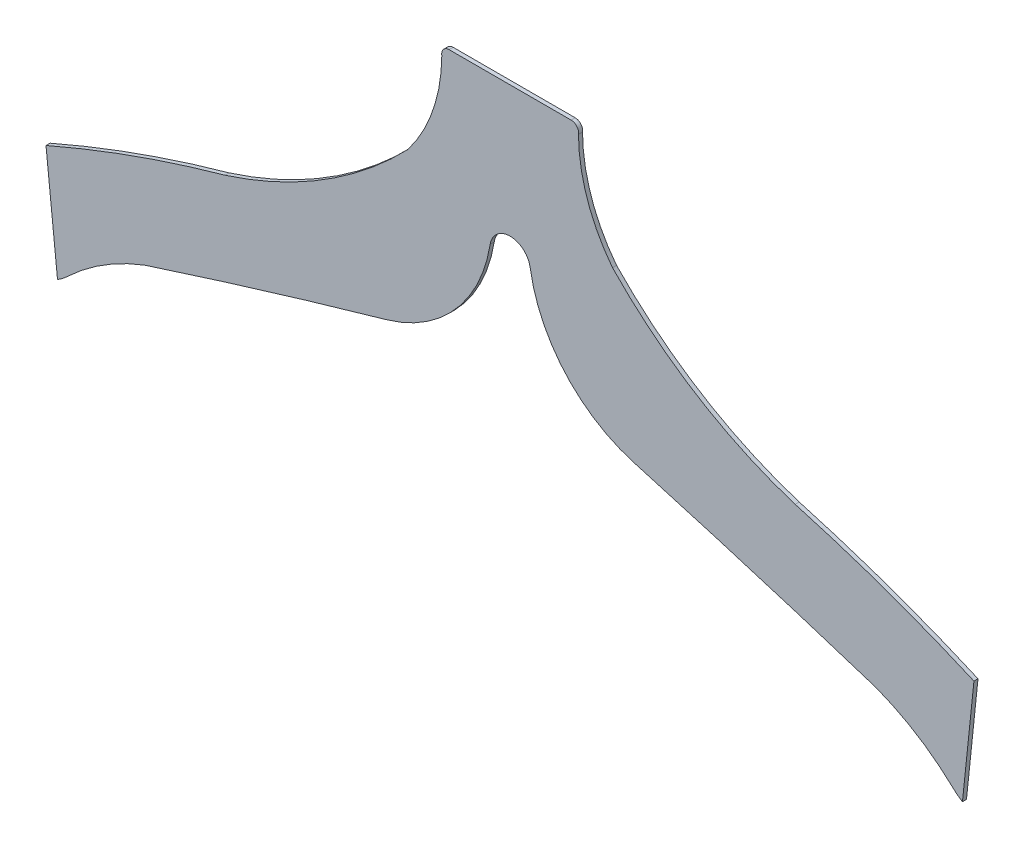
ISO-10303-21;
HEADER;
FILE_DESCRIPTION(('STEP AP214'),'2;1');
FILE_NAME('part.step','',(''),(''),'','','');
FILE_SCHEMA(('AUTOMOTIVE_DESIGN { 1 0 10303 214 1 1 1 1 }'));
ENDSEC;
DATA;
#1=APPLICATION_CONTEXT('core data for automotive mechanical design processes');
#2=APPLICATION_PROTOCOL_DEFINITION('international standard','automotive_design',2000,#1);
#3=PRODUCT_CONTEXT('',#1,'mechanical');
#4=PRODUCT('Part','Part','',(#3));
#5=PRODUCT_RELATED_PRODUCT_CATEGORY('part','',(#4));
#6=PRODUCT_DEFINITION_FORMATION('','',#4);
#7=PRODUCT_DEFINITION_CONTEXT('part definition',#1,'design');
#8=PRODUCT_DEFINITION('design','',#6,#7);
#9=PRODUCT_DEFINITION_SHAPE('','',#8);
#10=(LENGTH_UNIT() NAMED_UNIT(*) SI_UNIT(.MILLI.,.METRE.));
#11=(NAMED_UNIT(*) PLANE_ANGLE_UNIT() SI_UNIT($,.RADIAN.));
#12=(NAMED_UNIT(*) SI_UNIT($,.STERADIAN.) SOLID_ANGLE_UNIT());
#13=UNCERTAINTY_MEASURE_WITH_UNIT(LENGTH_MEASURE(1.E-05),#10,'distance_accuracy_value','');
#14=(GEOMETRIC_REPRESENTATION_CONTEXT(3) GLOBAL_UNCERTAINTY_ASSIGNED_CONTEXT((#13)) GLOBAL_UNIT_ASSIGNED_CONTEXT((#10,
#11,#12)) REPRESENTATION_CONTEXT('',''));
#15=CARTESIAN_POINT('',(0.,0.,0.));
#16=DIRECTION('',(0.,0.,1.));
#17=DIRECTION('',(1.,0.,0.));
#18=AXIS2_PLACEMENT_3D('',#15,#16,#17);
#19=CARTESIAN_POINT('',(-741.128045107195,819.426514046939,0.));
#20=DIRECTION('',(-0.994599825520508,-0.103784329619531,0.));
#21=DIRECTION('',(0.103784329619531,-0.994599825520508,0.));
#22=AXIS2_PLACEMENT_3D('',#19,#20,#21);
#23=PLANE('',#22);
#24=DIRECTION('',(0.103784329619531,-0.994599825520508,0.));
#25=VECTOR('',#24,1.);
#26=CARTESIAN_POINT('',(-433.648459855304,-2127.25284461701,6.35));
#27=LINE('',#26,#25);
#28=CARTESIAN_POINT('',(-728.290988065697,696.404717399258,6.35));
#29=VERTEX_POINT('',#28);
#30=CARTESIAN_POINT('',(-710.226925128052,523.29078091349,6.35));
#31=VERTEX_POINT('',#30);
#32=EDGE_CURVE('E185',#29,#31,#27,.T.);
#33=ORIENTED_EDGE('',*,*,#32,.F.);
#34=DIRECTION('',(0.,0.,-1.));
#35=VECTOR('',#34,1.);
#36=CARTESIAN_POINT('',(-728.290988065698,696.404717399258,6.35));
#37=LINE('',#36,#35);
#38=CARTESIAN_POINT('',(-728.290988065697,696.404717399258,0.));
#39=VERTEX_POINT('',#38);
#40=EDGE_CURVE('E40',#29,#39,#37,.T.);
#41=ORIENTED_EDGE('',*,*,#40,.T.);
#42=DIRECTION('',(0.103784329619531,-0.994599825520508,0.));
#43=VECTOR('',#42,1.);
#44=CARTESIAN_POINT('',(-433.648459855304,-2127.25284461701,0.));
#45=LINE('',#44,#43);
#46=CARTESIAN_POINT('',(-710.226925128052,523.29078091349,0.));
#47=VERTEX_POINT('',#46);
#48=EDGE_CURVE('E45',#39,#47,#45,.T.);
#49=ORIENTED_EDGE('',*,*,#48,.T.);
#50=DIRECTION('',(0.,0.,-1.));
#51=VECTOR('',#50,1.);
#52=CARTESIAN_POINT('',(-710.226925128052,523.29078091349,6.35));
#53=LINE('',#52,#51);
#54=EDGE_CURVE('E330',#47,#31,#53,.F.);
#55=ORIENTED_EDGE('',*,*,#54,.T.);
#56=EDGE_LOOP('',(#33,#41,#49,#55));
#57=FACE_BOUND('',#56,.T.);
#58=ADVANCED_FACE('F36',(#57),#23,.T.);
#59=CARTESIAN_POINT('',(741.128045107195,819.426514046939,0.));
#60=DIRECTION('',(0.994599825520508,-0.103784329619531,0.));
#61=DIRECTION('',(-0.103784329619531,-0.994599825520508,0.));
#62=AXIS2_PLACEMENT_3D('',#59,#60,#61);
#63=PLANE('',#62);
#64=DIRECTION('',(0.103784329619531,0.994599825520508,0.));
#65=VECTOR('',#64,1.);
#66=CARTESIAN_POINT('',(429.370376525692,-2168.25114319246,0.));
#67=LINE('',#66,#65);
#68=CARTESIAN_POINT('',(710.258120461249,523.58973618996,0.));
#69=VERTEX_POINT('',#68);
#70=CARTESIAN_POINT('',(728.313869882437,696.62400147634,0.));
#71=VERTEX_POINT('',#70);
#72=EDGE_CURVE('E11',#69,#71,#67,.T.);
#73=ORIENTED_EDGE('',*,*,#72,.T.);
#74=DIRECTION('',(0.,0.,-1.));
#75=VECTOR('',#74,1.);
#76=CARTESIAN_POINT('',(728.313869882437,696.624001476341,6.35));
#77=LINE('',#76,#75);
#78=CARTESIAN_POINT('',(728.313869882437,696.62400147634,6.35));
#79=VERTEX_POINT('',#78);
#80=EDGE_CURVE('E328',#71,#79,#77,.F.);
#81=ORIENTED_EDGE('',*,*,#80,.T.);
#82=DIRECTION('',(0.103784329619531,0.994599825520508,0.));
#83=VECTOR('',#82,1.);
#84=CARTESIAN_POINT('',(429.370376525692,-2168.25114319246,6.35));
#85=LINE('',#84,#83);
#86=CARTESIAN_POINT('',(710.258120461249,523.58973618996,6.35));
#87=VERTEX_POINT('',#86);
#88=EDGE_CURVE('E308',#87,#79,#85,.T.);
#89=ORIENTED_EDGE('',*,*,#88,.F.);
#90=DIRECTION('',(0.,0.,-1.));
#91=VECTOR('',#90,1.);
#92=CARTESIAN_POINT('',(710.258120461249,523.58973618996,6.35));
#93=LINE('',#92,#91);
#94=EDGE_CURVE('E323',#87,#69,#93,.T.);
#95=ORIENTED_EDGE('',*,*,#94,.T.);
#96=EDGE_LOOP('',(#73,#81,#89,#95));
#97=FACE_BOUND('',#96,.T.);
#98=ADVANCED_FACE('F38',(#97),#63,.T.);
#99=CARTESIAN_POINT('',(-756.045020140387,599.474192293135,6.35));
#100=DIRECTION('',(0.,0.,-1.));
#101=DIRECTION('',(-1.,0.,0.));
#102=AXIS2_PLACEMENT_3D('',#99,#100,#101);
#103=CYLINDRICAL_SURFACE('',#102,88.8999999999977);
#104=ORIENTED_EDGE('',*,*,#54,.F.);
#105=CARTESIAN_POINT('',(-756.045020140387,599.474192293135,0.));
#106=DIRECTION('',(0.,0.,1.));
#107=DIRECTION('',(1.,0.,0.));
#108=AXIS2_PLACEMENT_3D('',#105,#106,#107);
#109=CIRCLE('',#108,88.8999999999977);
#110=CARTESIAN_POINT('',(-694.888676897809,534.952012531491,0.));
#111=VERTEX_POINT('',#110);
#112=EDGE_CURVE('E61',#47,#111,#109,.T.);
#113=ORIENTED_EDGE('',*,*,#112,.T.);
#114=DIRECTION('',(0.,0.,-1.));
#115=VECTOR('',#114,1.);
#116=CARTESIAN_POINT('',(-694.888676897809,534.952012531491,6.35));
#117=LINE('',#116,#115);
#118=CARTESIAN_POINT('',(-694.888676897809,534.952012531491,6.35));
#119=VERTEX_POINT('',#118);
#120=EDGE_CURVE('E191',#119,#111,#117,.T.);
#121=ORIENTED_EDGE('',*,*,#120,.F.);
#122=CARTESIAN_POINT('',(-756.045020140387,599.474192293135,6.35));
#123=DIRECTION('',(0.,0.,1.));
#124=DIRECTION('',(1.,0.,0.));
#125=AXIS2_PLACEMENT_3D('',#122,#123,#124);
#126=CIRCLE('',#125,88.8999999999977);
#127=EDGE_CURVE('E177',#31,#119,#126,.T.);
#128=ORIENTED_EDGE('',*,*,#127,.F.);
#129=EDGE_LOOP('',(#104,#113,#121,#128));
#130=FACE_BOUND('',#129,.T.);
#131=ADVANCED_FACE('F192',(#130),#103,.T.);
#132=CARTESIAN_POINT('',(-444.41797899082,270.696261804016,6.35));
#133=DIRECTION('',(0.,0.,-1.));
#134=DIRECTION('',(-1.,0.,0.));
#135=AXIS2_PLACEMENT_3D('',#132,#133,#134);
#136=CYLINDRICAL_SURFACE('',#135,364.097064397058);
#137=CARTESIAN_POINT('',(-444.41797899082,270.696261804016,0.));
#138=DIRECTION('',(0.,0.,1.));
#139=DIRECTION('',(1.,0.,0.));
#140=AXIS2_PLACEMENT_3D('',#137,#138,#139);
#141=CIRCLE('',#140,364.097064397058);
#142=CARTESIAN_POINT('',(-573.361803176424,611.196133326676,0.));
#143=VERTEX_POINT('',#142);
#144=EDGE_CURVE('E245',#143,#111,#141,.T.);
#145=ORIENTED_EDGE('',*,*,#144,.F.);
#146=DIRECTION('',(0.,0.,-1.));
#147=VECTOR('',#146,1.);
#148=CARTESIAN_POINT('',(-573.361803176424,611.196133326676,6.35));
#149=LINE('',#148,#147);
#150=CARTESIAN_POINT('',(-573.361803176424,611.196133326676,6.35));
#151=VERTEX_POINT('',#150);
#152=EDGE_CURVE('E196',#151,#143,#149,.T.);
#153=ORIENTED_EDGE('',*,*,#152,.F.);
#154=CARTESIAN_POINT('',(-444.41797899082,270.696261804016,6.35));
#155=DIRECTION('',(0.,0.,1.));
#156=DIRECTION('',(1.,0.,0.));
#157=AXIS2_PLACEMENT_3D('',#154,#155,#156);
#158=CIRCLE('',#157,364.097064397058);
#159=EDGE_CURVE('E183',#151,#119,#158,.T.);
#160=ORIENTED_EDGE('',*,*,#159,.T.);
#161=ORIENTED_EDGE('',*,*,#120,.T.);
#162=EDGE_LOOP('',(#145,#153,#160,#161));
#163=FACE_BOUND('',#162,.T.);
#164=ADVANCED_FACE('F198',(#163),#136,.F.);
#165=CARTESIAN_POINT('',(2786.0605786399,-9735.41874096208,6.35));
#166=DIRECTION('',(0.,0.,-1.));
#167=DIRECTION('',(-1.,0.,0.));
#168=AXIS2_PLACEMENT_3D('',#165,#166,#167);
#169=CYLINDRICAL_SURFACE('',#168,10878.3343438369);
#170=CARTESIAN_POINT('',(2786.0605786399,-9735.41874096208,0.));
#171=DIRECTION('',(0.,0.,1.));
#172=DIRECTION('',(1.,0.,0.));
#173=AXIS2_PLACEMENT_3D('',#170,#171,#172);
#174=CIRCLE('',#173,10878.3343438369);
#175=CARTESIAN_POINT('',(-194.222460106335,726.706812923389,0.));
#176=VERTEX_POINT('',#175);
#177=EDGE_CURVE('E247',#176,#143,#174,.T.);
#178=ORIENTED_EDGE('',*,*,#177,.F.);
#179=DIRECTION('',(0.,0.,-1.));
#180=VECTOR('',#179,1.);
#181=CARTESIAN_POINT('',(-194.222460106335,726.706812923389,6.35));
#182=LINE('',#181,#180);
#183=CARTESIAN_POINT('',(-194.222460106335,726.706812923389,6.35));
#184=VERTEX_POINT('',#183);
#185=EDGE_CURVE('E318',#184,#176,#182,.T.);
#186=ORIENTED_EDGE('',*,*,#185,.F.);
#187=CARTESIAN_POINT('',(2786.0605786399,-9735.41874096208,6.35));
#188=DIRECTION('',(0.,0.,1.));
#189=DIRECTION('',(1.,0.,0.));
#190=AXIS2_PLACEMENT_3D('',#187,#188,#189);
#191=CIRCLE('',#190,10878.3343438369);
#192=EDGE_CURVE('E199',#184,#151,#191,.T.);
#193=ORIENTED_EDGE('',*,*,#192,.T.);
#194=ORIENTED_EDGE('',*,*,#152,.T.);
#195=EDGE_LOOP('',(#178,#186,#193,#194));
#196=FACE_BOUND('',#195,.T.);
#197=ADVANCED_FACE('F397',(#196),#169,.F.);
#198=CARTESIAN_POINT('',(-256.850862682769,946.560498793616,6.35));
#199=DIRECTION('',(0.,0.,-1.));
#200=DIRECTION('',(-1.,0.,0.));
#201=AXIS2_PLACEMENT_3D('',#198,#199,#200);
#202=CYLINDRICAL_SURFACE('',#201,228.599999999998);
#203=CARTESIAN_POINT('',(-256.850862682769,946.560498793616,0.));
#204=DIRECTION('',(0.,0.,1.));
#205=DIRECTION('',(1.,0.,0.));
#206=AXIS2_PLACEMENT_3D('',#203,#204,#205);
#207=CIRCLE('',#206,228.599999999998);
#208=CARTESIAN_POINT('',(-31.0929432685779,910.625532232135,0.));
#209=VERTEX_POINT('',#208);
#210=EDGE_CURVE('E250',#176,#209,#207,.T.);
#211=ORIENTED_EDGE('',*,*,#210,.T.);
#212=DIRECTION('',(0.,0.,-1.));
#213=VECTOR('',#212,1.);
#214=CARTESIAN_POINT('',(-31.0929432685779,910.625532232135,6.35));
#215=LINE('',#214,#213);
#216=CARTESIAN_POINT('',(-31.0929432685779,910.625532232135,6.35));
#217=VERTEX_POINT('',#216);
#218=EDGE_CURVE('E316',#217,#209,#215,.T.);
#219=ORIENTED_EDGE('',*,*,#218,.F.);
#220=CARTESIAN_POINT('',(-256.850862682769,946.560498793616,6.35));
#221=DIRECTION('',(0.,0.,1.));
#222=DIRECTION('',(1.,0.,0.));
#223=AXIS2_PLACEMENT_3D('',#220,#221,#222);
#224=CIRCLE('',#223,228.599999999998);
#225=EDGE_CURVE('E201',#184,#217,#224,.T.);
#226=ORIENTED_EDGE('',*,*,#225,.F.);
#227=ORIENTED_EDGE('',*,*,#185,.T.);
#228=EDGE_LOOP('',(#211,#219,#226,#227));
#229=FACE_BOUND('',#228,.T.);
#230=ADVANCED_FACE('F399',(#229),#202,.T.);
#231=CARTESIAN_POINT('',(0.262323316965851,905.634564654113,6.35));
#232=DIRECTION('',(0.,0.,-1.));
#233=DIRECTION('',(-1.,0.,0.));
#234=AXIS2_PLACEMENT_3D('',#231,#232,#233);
#235=CYLINDRICAL_SURFACE('',#234,31.7500000002423);
#236=CARTESIAN_POINT('',(0.262323316965851,905.634564654113,0.));
#237=DIRECTION('',(0.,0.,1.));
#238=DIRECTION('',(1.,0.,0.));
#239=AXIS2_PLACEMENT_3D('',#236,#237,#238);
#240=CIRCLE('',#239,31.7500000002423);
#241=CARTESIAN_POINT('',(31.6175899026052,910.625532232121,0.));
#242=VERTEX_POINT('',#241);
#243=EDGE_CURVE('E253',#242,#209,#240,.T.);
#244=ORIENTED_EDGE('',*,*,#243,.F.);
#245=DIRECTION('',(0.,0.,-1.));
#246=VECTOR('',#245,1.);
#247=CARTESIAN_POINT('',(31.6175899026052,910.625532232121,6.35));
#248=LINE('',#247,#246);
#249=CARTESIAN_POINT('',(31.6175899026052,910.625532232121,6.35));
#250=VERTEX_POINT('',#249);
#251=EDGE_CURVE('E314',#250,#242,#248,.T.);
#252=ORIENTED_EDGE('',*,*,#251,.F.);
#253=CARTESIAN_POINT('',(0.262323316965851,905.634564654113,6.35));
#254=DIRECTION('',(0.,0.,1.));
#255=DIRECTION('',(1.,0.,0.));
#256=AXIS2_PLACEMENT_3D('',#253,#254,#255);
#257=CIRCLE('',#256,31.7500000002423);
#258=EDGE_CURVE('E205',#250,#217,#257,.T.);
#259=ORIENTED_EDGE('',*,*,#258,.T.);
#260=ORIENTED_EDGE('',*,*,#218,.T.);
#261=EDGE_LOOP('',(#244,#252,#259,#260));
#262=FACE_BOUND('',#261,.T.);
#263=ADVANCED_FACE('F391',(#262),#235,.F.);
#264=CARTESIAN_POINT('',(257.375509316887,946.560498793614,6.35));
#265=DIRECTION('',(0.,0.,-1.));
#266=DIRECTION('',(-1.,0.,0.));
#267=AXIS2_PLACEMENT_3D('',#264,#265,#266);
#268=CYLINDRICAL_SURFACE('',#267,228.599999999998);
#269=CARTESIAN_POINT('',(257.375509316887,946.560498793614,0.));
#270=DIRECTION('',(0.,0.,1.));
#271=DIRECTION('',(1.,0.,0.));
#272=AXIS2_PLACEMENT_3D('',#269,#270,#271);
#273=CIRCLE('',#272,228.599999999998);
#274=CARTESIAN_POINT('',(194.747106758705,726.70681291819,0.));
#275=VERTEX_POINT('',#274);
#276=EDGE_CURVE('E256',#242,#275,#273,.T.);
#277=ORIENTED_EDGE('',*,*,#276,.T.);
#278=DIRECTION('',(0.,0.,-1.));
#279=VECTOR('',#278,1.);
#280=CARTESIAN_POINT('',(194.747106758705,726.70681291819,6.35));
#281=LINE('',#280,#279);
#282=CARTESIAN_POINT('',(194.747106758705,726.70681291819,6.35));
#283=VERTEX_POINT('',#282);
#284=EDGE_CURVE('E312',#283,#275,#281,.T.);
#285=ORIENTED_EDGE('',*,*,#284,.F.);
#286=CARTESIAN_POINT('',(257.375509316887,946.560498793614,6.35));
#287=DIRECTION('',(0.,0.,1.));
#288=DIRECTION('',(1.,0.,0.));
#289=AXIS2_PLACEMENT_3D('',#286,#287,#288);
#290=CIRCLE('',#289,228.599999999998);
#291=EDGE_CURVE('E208',#250,#283,#290,.T.);
#292=ORIENTED_EDGE('',*,*,#291,.F.);
#293=ORIENTED_EDGE('',*,*,#251,.T.);
#294=EDGE_LOOP('',(#277,#285,#292,#293));
#295=FACE_BOUND('',#294,.T.);
#296=ADVANCED_FACE('F388',(#295),#268,.T.);
#297=CARTESIAN_POINT('',(-2785.53593200578,-9735.41874096208,6.35));
#298=DIRECTION('',(0.,0.,-1.));
#299=DIRECTION('',(-1.,0.,0.));
#300=AXIS2_PLACEMENT_3D('',#297,#298,#299);
#301=CYLINDRICAL_SURFACE('',#300,10878.3343438369);
#302=CARTESIAN_POINT('',(-2785.53593200578,-9735.41874096208,0.));
#303=DIRECTION('',(0.,0.,1.));
#304=DIRECTION('',(1.,0.,0.));
#305=AXIS2_PLACEMENT_3D('',#302,#303,#304);
#306=CIRCLE('',#305,10878.3343438369);
#307=CARTESIAN_POINT('',(573.886449810543,611.196133326675,0.));
#308=VERTEX_POINT('',#307);
#309=EDGE_CURVE('E259',#308,#275,#306,.T.);
#310=ORIENTED_EDGE('',*,*,#309,.F.);
#311=DIRECTION('',(0.,0.,-1.));
#312=VECTOR('',#311,1.);
#313=CARTESIAN_POINT('',(573.886449810543,611.196133326675,6.35));
#314=LINE('',#313,#312);
#315=CARTESIAN_POINT('',(573.886449810543,611.196133326675,6.35));
#316=VERTEX_POINT('',#315);
#317=EDGE_CURVE('E310',#316,#308,#314,.T.);
#318=ORIENTED_EDGE('',*,*,#317,.F.);
#319=CARTESIAN_POINT('',(-2785.53593200578,-9735.41874096208,6.35));
#320=DIRECTION('',(0.,0.,1.));
#321=DIRECTION('',(1.,0.,0.));
#322=AXIS2_PLACEMENT_3D('',#319,#320,#321);
#323=CIRCLE('',#322,10878.3343438369);
#324=EDGE_CURVE('E210',#316,#283,#323,.T.);
#325=ORIENTED_EDGE('',*,*,#324,.T.);
#326=ORIENTED_EDGE('',*,*,#284,.T.);
#327=EDGE_LOOP('',(#310,#318,#325,#326));
#328=FACE_BOUND('',#327,.T.);
#329=ADVANCED_FACE('F384',(#328),#301,.F.);
#330=CARTESIAN_POINT('',(444.942625624939,270.696261804018,6.35));
#331=DIRECTION('',(0.,0.,-1.));
#332=DIRECTION('',(-1.,0.,0.));
#333=AXIS2_PLACEMENT_3D('',#330,#331,#332);
#334=CYLINDRICAL_SURFACE('',#333,364.097064397057);
#335=CARTESIAN_POINT('',(444.942625624939,270.696261804018,0.));
#336=DIRECTION('',(0.,0.,1.));
#337=DIRECTION('',(1.,0.,0.));
#338=AXIS2_PLACEMENT_3D('',#335,#336,#337);
#339=CIRCLE('',#338,364.097064397057);
#340=CARTESIAN_POINT('',(695.413323532098,534.95201253133,0.));
#341=VERTEX_POINT('',#340);
#342=EDGE_CURVE('E262',#341,#308,#339,.T.);
#343=ORIENTED_EDGE('',*,*,#342,.F.);
#344=DIRECTION('',(0.,0.,-1.));
#345=VECTOR('',#344,1.);
#346=CARTESIAN_POINT('',(695.413323532098,534.95201253133,6.35));
#347=LINE('',#346,#345);
#348=CARTESIAN_POINT('',(695.413323532098,534.95201253133,6.35));
#349=VERTEX_POINT('',#348);
#350=EDGE_CURVE('E243',#349,#341,#347,.T.);
#351=ORIENTED_EDGE('',*,*,#350,.F.);
#352=CARTESIAN_POINT('',(444.942625624939,270.696261804018,6.35));
#353=DIRECTION('',(0.,0.,1.));
#354=DIRECTION('',(1.,0.,0.));
#355=AXIS2_PLACEMENT_3D('',#352,#353,#354);
#356=CIRCLE('',#355,364.097064397057);
#357=EDGE_CURVE('E213',#349,#316,#356,.T.);
#358=ORIENTED_EDGE('',*,*,#357,.T.);
#359=ORIENTED_EDGE('',*,*,#317,.T.);
#360=EDGE_LOOP('',(#343,#351,#358,#359));
#361=FACE_BOUND('',#360,.T.);
#362=ADVANCED_FACE('F379',(#361),#334,.F.);
#363=CARTESIAN_POINT('',(756.569666774507,599.474192293135,6.35));
#364=DIRECTION('',(0.,0.,-1.));
#365=DIRECTION('',(-1.,0.,0.));
#366=AXIS2_PLACEMENT_3D('',#363,#364,#365);
#367=CYLINDRICAL_SURFACE('',#366,88.8999999999979);
#368=ORIENTED_EDGE('',*,*,#94,.F.);
#369=CARTESIAN_POINT('',(756.569666774507,599.474192293135,6.35));
#370=DIRECTION('',(0.,0.,1.));
#371=DIRECTION('',(1.,0.,0.));
#372=AXIS2_PLACEMENT_3D('',#369,#370,#371);
#373=CIRCLE('',#372,88.8999999999979);
#374=EDGE_CURVE('E216',#349,#87,#373,.T.);
#375=ORIENTED_EDGE('',*,*,#374,.F.);
#376=ORIENTED_EDGE('',*,*,#350,.T.);
#377=CARTESIAN_POINT('',(756.569666774507,599.474192293135,0.));
#378=DIRECTION('',(0.,0.,1.));
#379=DIRECTION('',(1.,0.,0.));
#380=AXIS2_PLACEMENT_3D('',#377,#378,#379);
#381=CIRCLE('',#380,88.8999999999979);
#382=EDGE_CURVE('E53',#341,#69,#381,.T.);
#383=ORIENTED_EDGE('',*,*,#382,.T.);
#384=EDGE_LOOP('',(#368,#375,#376,#383));
#385=FACE_BOUND('',#384,.T.);
#386=ADVANCED_FACE('F374',(#385),#367,.T.);
#387=CARTESIAN_POINT('',(-127.079351285284,-1261.36654521042,6.35));
#388=DIRECTION('',(0.,0.,-1.));
#389=DIRECTION('',(-1.,0.,0.));
#390=AXIS2_PLACEMENT_3D('',#387,#388,#389);
#391=CYLINDRICAL_SURFACE('',#390,2136.68541056806);
#392=ORIENTED_EDGE('',*,*,#80,.F.);
#393=CARTESIAN_POINT('',(-127.079351285284,-1261.36654521042,0.));
#394=DIRECTION('',(0.,0.,1.));
#395=DIRECTION('',(1.,0.,0.));
#396=AXIS2_PLACEMENT_3D('',#393,#394,#395);
#397=CIRCLE('',#396,2136.68541056806);
#398=CARTESIAN_POINT('',(447.674096574527,796.565187842857,0.));
#399=VERTEX_POINT('',#398);
#400=EDGE_CURVE('E266',#71,#399,#397,.T.);
#401=ORIENTED_EDGE('',*,*,#400,.T.);
#402=DIRECTION('',(0.,0.,-1.));
#403=VECTOR('',#402,1.);
#404=CARTESIAN_POINT('',(447.674096574527,796.565187842857,6.35));
#405=LINE('',#404,#403);
#406=CARTESIAN_POINT('',(447.674096574527,796.565187842857,6.35));
#407=VERTEX_POINT('',#406);
#408=EDGE_CURVE('E305',#407,#399,#405,.T.);
#409=ORIENTED_EDGE('',*,*,#408,.F.);
#410=CARTESIAN_POINT('',(-127.079351285284,-1261.36654521042,6.35));
#411=DIRECTION('',(0.,0.,1.));
#412=DIRECTION('',(1.,0.,0.));
#413=AXIS2_PLACEMENT_3D('',#410,#411,#412);
#414=CIRCLE('',#413,2136.68541056806);
#415=EDGE_CURVE('E219',#79,#407,#414,.T.);
#416=ORIENTED_EDGE('',*,*,#415,.F.);
#417=EDGE_LOOP('',(#392,#401,#409,#416));
#418=FACE_BOUND('',#417,.T.);
#419=ADVANCED_FACE('F371',(#418),#391,.T.);
#420=CARTESIAN_POINT('',(654.541492006818,1448.91295249059,6.35));
#421=DIRECTION('',(0.,0.,-1.));
#422=DIRECTION('',(-1.,0.,0.));
#423=AXIS2_PLACEMENT_3D('',#420,#421,#422);
#424=CYLINDRICAL_SURFACE('',#423,684.362276381331);
#425=CARTESIAN_POINT('',(654.541492006818,1448.91295249059,0.));
#426=DIRECTION('',(0.,0.,1.));
#427=DIRECTION('',(1.,0.,0.));
#428=AXIS2_PLACEMENT_3D('',#425,#426,#427);
#429=CIRCLE('',#428,684.362276381331);
#430=CARTESIAN_POINT('',(160.996998513016,974.818491147936,0.));
#431=VERTEX_POINT('',#430);
#432=EDGE_CURVE('E268',#431,#399,#429,.T.);
#433=ORIENTED_EDGE('',*,*,#432,.F.);
#434=DIRECTION('',(0.,0.,-1.));
#435=VECTOR('',#434,1.);
#436=CARTESIAN_POINT('',(160.996998513016,974.818491147936,6.35));
#437=LINE('',#436,#435);
#438=CARTESIAN_POINT('',(160.996998513016,974.818491147936,6.35));
#439=VERTEX_POINT('',#438);
#440=EDGE_CURVE('E303',#439,#431,#437,.T.);
#441=ORIENTED_EDGE('',*,*,#440,.F.);
#442=CARTESIAN_POINT('',(654.541492006818,1448.91295249059,6.35));
#443=DIRECTION('',(0.,0.,1.));
#444=DIRECTION('',(1.,0.,0.));
#445=AXIS2_PLACEMENT_3D('',#442,#443,#444);
#446=CIRCLE('',#445,684.362276381331);
#447=EDGE_CURVE('E221',#439,#407,#446,.T.);
#448=ORIENTED_EDGE('',*,*,#447,.T.);
#449=ORIENTED_EDGE('',*,*,#408,.T.);
#450=EDGE_LOOP('',(#433,#441,#448,#449));
#451=FACE_BOUND('',#450,.T.);
#452=ADVANCED_FACE('F365',(#451),#424,.F.);
#453=CARTESIAN_POINT('',(362.407558283615,1131.0798517805,6.35));
#454=DIRECTION('',(0.,0.,-1.));
#455=DIRECTION('',(-1.,0.,0.));
#456=AXIS2_PLACEMENT_3D('',#453,#454,#455);
#457=CYLINDRICAL_SURFACE('',#456,254.919254694201);
#458=CARTESIAN_POINT('',(362.407558283615,1131.0798517805,0.));
#459=DIRECTION('',(0.,0.,1.));
#460=DIRECTION('',(1.,0.,0.));
#461=AXIS2_PLACEMENT_3D('',#458,#459,#460);
#462=CIRCLE('',#461,254.919254694201);
#463=CARTESIAN_POINT('',(107.494353314584,1129.32362108274,0.));
#464=VERTEX_POINT('',#463);
#465=EDGE_CURVE('E271',#464,#431,#462,.T.);
#466=ORIENTED_EDGE('',*,*,#465,.F.);
#467=DIRECTION('',(0.,0.,-1.));
#468=VECTOR('',#467,1.);
#469=CARTESIAN_POINT('',(107.494353314584,1129.32362108274,6.35));
#470=LINE('',#469,#468);
#471=CARTESIAN_POINT('',(107.494353314584,1129.32362108274,6.35));
#472=VERTEX_POINT('',#471);
#473=EDGE_CURVE('E301',#472,#464,#470,.T.);
#474=ORIENTED_EDGE('',*,*,#473,.F.);
#475=CARTESIAN_POINT('',(362.407558283615,1131.0798517805,6.35));
#476=DIRECTION('',(0.,0.,1.));
#477=DIRECTION('',(1.,0.,0.));
#478=AXIS2_PLACEMENT_3D('',#475,#476,#477);
#479=CIRCLE('',#478,254.919254694201);
#480=EDGE_CURVE('E224',#472,#439,#479,.T.);
#481=ORIENTED_EDGE('',*,*,#480,.T.);
#482=ORIENTED_EDGE('',*,*,#440,.T.);
#483=EDGE_LOOP('',(#466,#474,#481,#482));
#484=FACE_BOUND('',#483,.T.);
#485=ADVANCED_FACE('F360',(#484),#457,.F.);
#486=CARTESIAN_POINT('',(96.0841104096599,1131.46551472001,6.35));
#487=DIRECTION('',(0.,0.,-1.));
#488=DIRECTION('',(-1.,0.,0.));
#489=AXIS2_PLACEMENT_3D('',#486,#487,#488);
#490=CYLINDRICAL_SURFACE('',#489,11.6095370925259);
#491=CARTESIAN_POINT('',(96.0841104096599,1131.46551472001,0.));
#492=DIRECTION('',(0.,0.,1.));
#493=DIRECTION('',(1.,0.,0.));
#494=AXIS2_PLACEMENT_3D('',#491,#492,#493);
#495=CIRCLE('',#494,11.6095370925259);
#496=CARTESIAN_POINT('',(96.08411040966,1143.07505181253,0.));
#497=VERTEX_POINT('',#496);
#498=EDGE_CURVE('E274',#464,#497,#495,.T.);
#499=ORIENTED_EDGE('',*,*,#498,.T.);
#500=DIRECTION('',(0.,0.,-1.));
#501=VECTOR('',#500,1.);
#502=CARTESIAN_POINT('',(96.08411040966,1143.07505181253,6.35));
#503=LINE('',#502,#501);
#504=CARTESIAN_POINT('',(96.08411040966,1143.07505181253,6.35));
#505=VERTEX_POINT('',#504);
#506=EDGE_CURVE('E298',#505,#497,#503,.T.);
#507=ORIENTED_EDGE('',*,*,#506,.F.);
#508=CARTESIAN_POINT('',(96.0841104096599,1131.46551472001,6.35));
#509=DIRECTION('',(0.,0.,1.));
#510=DIRECTION('',(1.,0.,0.));
#511=AXIS2_PLACEMENT_3D('',#508,#509,#510);
#512=CIRCLE('',#511,11.6095370925259);
#513=EDGE_CURVE('E227',#472,#505,#512,.T.);
#514=ORIENTED_EDGE('',*,*,#513,.F.);
#515=ORIENTED_EDGE('',*,*,#473,.T.);
#516=EDGE_LOOP('',(#499,#507,#514,#515));
#517=FACE_BOUND('',#516,.T.);
#518=ADVANCED_FACE('F357',(#517),#490,.T.);
#519=CARTESIAN_POINT('',(-198.589222338844,1143.07505181253,6.35));
#520=DIRECTION('',(0.,-1.,0.));
#521=DIRECTION('',(0.,0.,-1.));
#522=AXIS2_PLACEMENT_3D('',#519,#520,#521);
#523=PLANE('',#522);
#524=DIRECTION('',(-1.,0.,0.));
#525=VECTOR('',#524,1.);
#526=CARTESIAN_POINT('',(-198.589222338844,1143.07505181253,0.));
#527=LINE('',#526,#525);
#528=CARTESIAN_POINT('',(-95.5594637757691,1143.07505181253,0.));
#529=VERTEX_POINT('',#528);
#530=EDGE_CURVE('E277',#497,#529,#527,.T.);
#531=ORIENTED_EDGE('',*,*,#530,.T.);
#532=DIRECTION('',(0.,0.,-1.));
#533=VECTOR('',#532,1.);
#534=CARTESIAN_POINT('',(-95.5594637757691,1143.07505181253,6.35));
#535=LINE('',#534,#533);
#536=CARTESIAN_POINT('',(-95.5594637757691,1143.07505181253,6.35));
#537=VERTEX_POINT('',#536);
#538=EDGE_CURVE('E295',#537,#529,#535,.T.);
#539=ORIENTED_EDGE('',*,*,#538,.F.);
#540=DIRECTION('',(-1.,0.,0.));
#541=VECTOR('',#540,1.);
#542=CARTESIAN_POINT('',(-198.589222338844,1143.07505181253,6.35));
#543=LINE('',#542,#541);
#544=EDGE_CURVE('E230',#505,#537,#543,.T.);
#545=ORIENTED_EDGE('',*,*,#544,.F.);
#546=ORIENTED_EDGE('',*,*,#506,.T.);
#547=EDGE_LOOP('',(#531,#539,#545,#546));
#548=FACE_BOUND('',#547,.T.);
#549=ADVANCED_FACE('F353',(#548),#523,.F.);
#550=CARTESIAN_POINT('',(-95.5594637757682,1131.46551472001,6.35));
#551=DIRECTION('',(0.,0.,-1.));
#552=DIRECTION('',(-1.,0.,0.));
#553=AXIS2_PLACEMENT_3D('',#550,#551,#552);
#554=CYLINDRICAL_SURFACE('',#553,11.6095370925253);
#555=CARTESIAN_POINT('',(-95.5594637757682,1131.46551472001,0.));
#556=DIRECTION('',(0.,0.,1.));
#557=DIRECTION('',(1.,0.,0.));
#558=AXIS2_PLACEMENT_3D('',#555,#556,#557);
#559=CIRCLE('',#558,11.6095370925253);
#560=CARTESIAN_POINT('',(-106.969706680692,1129.32362108274,0.));
#561=VERTEX_POINT('',#560);
#562=EDGE_CURVE('E280',#529,#561,#559,.T.);
#563=ORIENTED_EDGE('',*,*,#562,.T.);
#564=DIRECTION('',(0.,0.,-1.));
#565=VECTOR('',#564,1.);
#566=CARTESIAN_POINT('',(-106.969706680692,1129.32362108274,6.35));
#567=LINE('',#566,#565);
#568=CARTESIAN_POINT('',(-106.969706680692,1129.32362108274,6.35));
#569=VERTEX_POINT('',#568);
#570=EDGE_CURVE('E293',#569,#561,#567,.T.);
#571=ORIENTED_EDGE('',*,*,#570,.F.);
#572=CARTESIAN_POINT('',(-95.5594637757682,1131.46551472001,6.35));
#573=DIRECTION('',(0.,0.,1.));
#574=DIRECTION('',(1.,0.,0.));
#575=AXIS2_PLACEMENT_3D('',#572,#573,#574);
#576=CIRCLE('',#575,11.6095370925253);
#577=EDGE_CURVE('E233',#537,#569,#576,.T.);
#578=ORIENTED_EDGE('',*,*,#577,.F.);
#579=ORIENTED_EDGE('',*,*,#538,.T.);
#580=EDGE_LOOP('',(#563,#571,#578,#579));
#581=FACE_BOUND('',#580,.T.);
#582=ADVANCED_FACE('F351',(#581),#554,.T.);
#583=CARTESIAN_POINT('',(-361.882911649722,1131.0798517805,6.35));
#584=DIRECTION('',(0.,0.,-1.));
#585=DIRECTION('',(-1.,0.,0.));
#586=AXIS2_PLACEMENT_3D('',#583,#584,#585);
#587=CYLINDRICAL_SURFACE('',#586,254.919254694199);
#588=CARTESIAN_POINT('',(-361.882911649722,1131.0798517805,0.));
#589=DIRECTION('',(0.,0.,1.));
#590=DIRECTION('',(1.,0.,0.));
#591=AXIS2_PLACEMENT_3D('',#588,#589,#590);
#592=CIRCLE('',#591,254.919254694199);
#593=CARTESIAN_POINT('',(-160.472351879237,974.818491147793,0.));
#594=VERTEX_POINT('',#593);
#595=EDGE_CURVE('E283',#594,#561,#592,.T.);
#596=ORIENTED_EDGE('',*,*,#595,.F.);
#597=DIRECTION('',(0.,0.,-1.));
#598=VECTOR('',#597,1.);
#599=CARTESIAN_POINT('',(-160.472351879237,974.818491147793,6.35));
#600=LINE('',#599,#598);
#601=CARTESIAN_POINT('',(-160.472351879237,974.818491147793,6.35));
#602=VERTEX_POINT('',#601);
#603=EDGE_CURVE('E291',#602,#594,#600,.T.);
#604=ORIENTED_EDGE('',*,*,#603,.F.);
#605=CARTESIAN_POINT('',(-361.882911649722,1131.0798517805,6.35));
#606=DIRECTION('',(0.,0.,1.));
#607=DIRECTION('',(1.,0.,0.));
#608=AXIS2_PLACEMENT_3D('',#605,#606,#607);
#609=CIRCLE('',#608,254.919254694199);
#610=EDGE_CURVE('E235',#602,#569,#609,.T.);
#611=ORIENTED_EDGE('',*,*,#610,.T.);
#612=ORIENTED_EDGE('',*,*,#570,.T.);
#613=EDGE_LOOP('',(#596,#604,#611,#612));
#614=FACE_BOUND('',#613,.T.);
#615=ADVANCED_FACE('F346',(#614),#587,.F.);
#616=CARTESIAN_POINT('',(-654.016845372911,1448.91295249058,6.35));
#617=DIRECTION('',(0.,0.,-1.));
#618=DIRECTION('',(-1.,0.,0.));
#619=AXIS2_PLACEMENT_3D('',#616,#617,#618);
#620=CYLINDRICAL_SURFACE('',#619,684.362276381327);
#621=CARTESIAN_POINT('',(-654.016845372911,1448.91295249058,0.));
#622=DIRECTION('',(0.,0.,1.));
#623=DIRECTION('',(1.,0.,0.));
#624=AXIS2_PLACEMENT_3D('',#621,#622,#623);
#625=CIRCLE('',#624,684.362276381327);
#626=CARTESIAN_POINT('',(-447.149449940617,796.565187842847,0.));
#627=VERTEX_POINT('',#626);
#628=EDGE_CURVE('E286',#627,#594,#625,.T.);
#629=ORIENTED_EDGE('',*,*,#628,.F.);
#630=DIRECTION('',(0.,0.,-1.));
#631=VECTOR('',#630,1.);
#632=CARTESIAN_POINT('',(-447.149449940617,796.565187842847,6.35));
#633=LINE('',#632,#631);
#634=CARTESIAN_POINT('',(-447.149449940617,796.565187842847,6.35));
#635=VERTEX_POINT('',#634);
#636=EDGE_CURVE('E195',#635,#627,#633,.T.);
#637=ORIENTED_EDGE('',*,*,#636,.F.);
#638=CARTESIAN_POINT('',(-654.016845372911,1448.91295249058,6.35));
#639=DIRECTION('',(0.,0.,1.));
#640=DIRECTION('',(1.,0.,0.));
#641=AXIS2_PLACEMENT_3D('',#638,#639,#640);
#642=CIRCLE('',#641,684.362276381327);
#643=EDGE_CURVE('E238',#635,#602,#642,.T.);
#644=ORIENTED_EDGE('',*,*,#643,.T.);
#645=ORIENTED_EDGE('',*,*,#603,.T.);
#646=EDGE_LOOP('',(#629,#637,#644,#645));
#647=FACE_BOUND('',#646,.T.);
#648=ADVANCED_FACE('F341',(#647),#620,.F.);
#649=CARTESIAN_POINT('',(127.603997919187,-1261.36654521043,6.35));
#650=DIRECTION('',(0.,0.,-1.));
#651=DIRECTION('',(-1.,0.,0.));
#652=AXIS2_PLACEMENT_3D('',#649,#650,#651);
#653=CYLINDRICAL_SURFACE('',#652,2136.68541056806);
#654=ORIENTED_EDGE('',*,*,#40,.F.);
#655=CARTESIAN_POINT('',(127.603997919187,-1261.36654521043,6.35));
#656=DIRECTION('',(0.,0.,1.));
#657=DIRECTION('',(1.,0.,0.));
#658=AXIS2_PLACEMENT_3D('',#655,#656,#657);
#659=CIRCLE('',#658,2136.68541056806);
#660=EDGE_CURVE('E241',#635,#29,#659,.T.);
#661=ORIENTED_EDGE('',*,*,#660,.F.);
#662=ORIENTED_EDGE('',*,*,#636,.T.);
#663=CARTESIAN_POINT('',(127.603997919187,-1261.36654521043,0.));
#664=DIRECTION('',(0.,0.,1.));
#665=DIRECTION('',(1.,0.,0.));
#666=AXIS2_PLACEMENT_3D('',#663,#664,#665);
#667=CIRCLE('',#666,2136.68541056806);
#668=EDGE_CURVE('E188',#627,#39,#667,.T.);
#669=ORIENTED_EDGE('',*,*,#668,.T.);
#670=EDGE_LOOP('',(#654,#661,#662,#669));
#671=FACE_BOUND('',#670,.T.);
#672=ADVANCED_FACE('F538',(#671),#653,.T.);
#673=CARTESIAN_POINT('',(-198.589222338844,-2102.72492418051,0.));
#674=DIRECTION('',(0.,0.,1.));
#675=DIRECTION('',(1.,0.,0.));
#676=AXIS2_PLACEMENT_3D('',#673,#674,#675);
#677=PLANE('',#676);
#678=ORIENTED_EDGE('',*,*,#48,.F.);
#679=ORIENTED_EDGE('',*,*,#668,.F.);
#680=ORIENTED_EDGE('',*,*,#628,.T.);
#681=ORIENTED_EDGE('',*,*,#595,.T.);
#682=ORIENTED_EDGE('',*,*,#562,.F.);
#683=ORIENTED_EDGE('',*,*,#530,.F.);
#684=ORIENTED_EDGE('',*,*,#498,.F.);
#685=ORIENTED_EDGE('',*,*,#465,.T.);
#686=ORIENTED_EDGE('',*,*,#432,.T.);
#687=ORIENTED_EDGE('',*,*,#400,.F.);
#688=ORIENTED_EDGE('',*,*,#72,.F.);
#689=ORIENTED_EDGE('',*,*,#382,.F.);
#690=ORIENTED_EDGE('',*,*,#342,.T.);
#691=ORIENTED_EDGE('',*,*,#309,.T.);
#692=ORIENTED_EDGE('',*,*,#276,.F.);
#693=ORIENTED_EDGE('',*,*,#243,.T.);
#694=ORIENTED_EDGE('',*,*,#210,.F.);
#695=ORIENTED_EDGE('',*,*,#177,.T.);
#696=ORIENTED_EDGE('',*,*,#144,.T.);
#697=ORIENTED_EDGE('',*,*,#112,.F.);
#698=EDGE_LOOP('',(#678,#679,#680,#681,#682,#683,#684,#685,#686,#687,#688,#689,#690,#691,#692,
#693,#694,#695,#696,#697));
#699=FACE_BOUND('',#698,.T.);
#700=ADVANCED_FACE('F338',(#699),#677,.F.);
#701=CARTESIAN_POINT('',(-198.589222338844,-2102.72492418051,6.35));
#702=DIRECTION('',(0.,0.,1.));
#703=DIRECTION('',(1.,0.,0.));
#704=AXIS2_PLACEMENT_3D('',#701,#702,#703);
#705=PLANE('',#704);
#706=ORIENTED_EDGE('',*,*,#660,.T.);
#707=ORIENTED_EDGE('',*,*,#32,.T.);
#708=ORIENTED_EDGE('',*,*,#127,.T.);
#709=ORIENTED_EDGE('',*,*,#159,.F.);
#710=ORIENTED_EDGE('',*,*,#192,.F.);
#711=ORIENTED_EDGE('',*,*,#225,.T.);
#712=ORIENTED_EDGE('',*,*,#258,.F.);
#713=ORIENTED_EDGE('',*,*,#291,.T.);
#714=ORIENTED_EDGE('',*,*,#324,.F.);
#715=ORIENTED_EDGE('',*,*,#357,.F.);
#716=ORIENTED_EDGE('',*,*,#374,.T.);
#717=ORIENTED_EDGE('',*,*,#88,.T.);
#718=ORIENTED_EDGE('',*,*,#415,.T.);
#719=ORIENTED_EDGE('',*,*,#447,.F.);
#720=ORIENTED_EDGE('',*,*,#480,.F.);
#721=ORIENTED_EDGE('',*,*,#513,.T.);
#722=ORIENTED_EDGE('',*,*,#544,.T.);
#723=ORIENTED_EDGE('',*,*,#577,.T.);
#724=ORIENTED_EDGE('',*,*,#610,.F.);
#725=ORIENTED_EDGE('',*,*,#643,.F.);
#726=EDGE_LOOP('',(#706,#707,#708,#709,#710,#711,#712,#713,#714,#715,#716,#717,#718,#719,#720,
#721,#722,#723,#724,#725));
#727=FACE_BOUND('',#726,.T.);
#728=ADVANCED_FACE('F180',(#727),#705,.T.);
#729=CLOSED_SHELL('',(#58,#98,#131,#164,#197,#230,#263,#296,#329,#362,#386,#419,#452,#485,#518,
#549,#582,#615,#648,#672,#700,#728));
#730=MANIFOLD_SOLID_BREP('B2',#729);
#731=ADVANCED_BREP_SHAPE_REPRESENTATION('',(#18,#730),#14);
#732=SHAPE_DEFINITION_REPRESENTATION(#9,#731);
ENDSEC;
END-ISO-10303-21;
